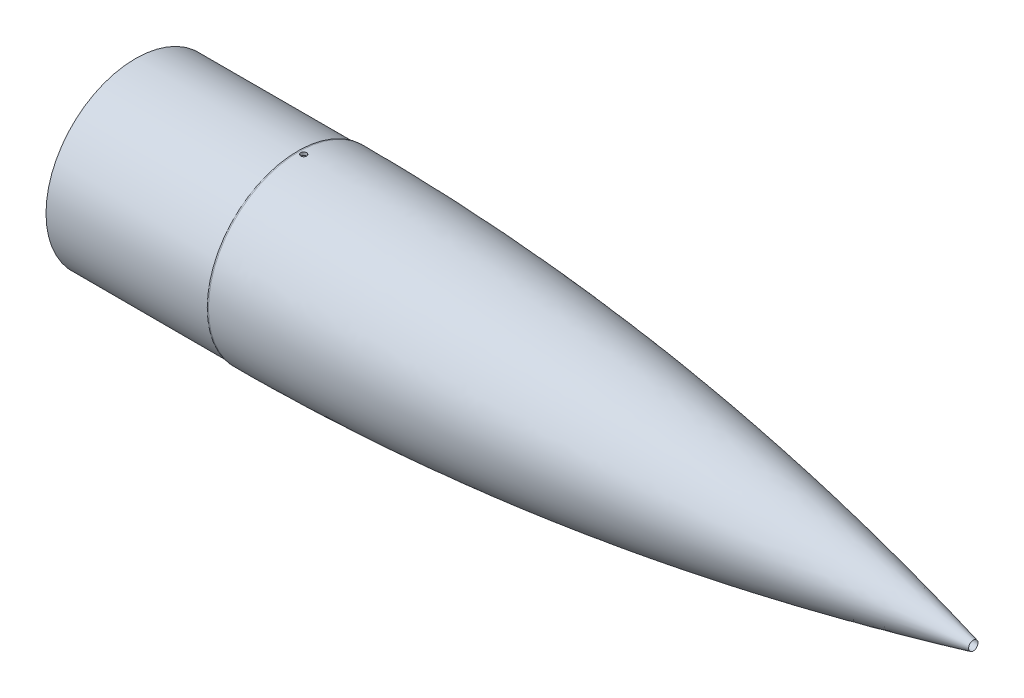
ISO-10303-21;
HEADER;
FILE_DESCRIPTION(('STEP AP214'),'2;1');
FILE_NAME('part.step','',(''),(''),'','','');
FILE_SCHEMA(('AUTOMOTIVE_DESIGN { 1 0 10303 214 1 1 1 1 }'));
ENDSEC;
DATA;
#1=APPLICATION_CONTEXT('core data for automotive mechanical design processes');
#2=APPLICATION_PROTOCOL_DEFINITION('international standard','automotive_design',2000,#1);
#3=PRODUCT_CONTEXT('',#1,'mechanical');
#4=PRODUCT('Part','Part','',(#3));
#5=PRODUCT_RELATED_PRODUCT_CATEGORY('part','',(#4));
#6=PRODUCT_DEFINITION_FORMATION('','',#4);
#7=PRODUCT_DEFINITION_CONTEXT('part definition',#1,'design');
#8=PRODUCT_DEFINITION('design','',#6,#7);
#9=PRODUCT_DEFINITION_SHAPE('','',#8);
#10=(LENGTH_UNIT() NAMED_UNIT(*) SI_UNIT(.MILLI.,.METRE.));
#11=(NAMED_UNIT(*) PLANE_ANGLE_UNIT() SI_UNIT($,.RADIAN.));
#12=(NAMED_UNIT(*) SI_UNIT($,.STERADIAN.) SOLID_ANGLE_UNIT());
#13=UNCERTAINTY_MEASURE_WITH_UNIT(LENGTH_MEASURE(1.E-05),#10,'distance_accuracy_value','');
#14=(GEOMETRIC_REPRESENTATION_CONTEXT(3) GLOBAL_UNCERTAINTY_ASSIGNED_CONTEXT((#13)) GLOBAL_UNIT_ASSIGNED_CONTEXT((#10,
#11,#12)) REPRESENTATION_CONTEXT('',''));
#15=CARTESIAN_POINT('',(0.,0.,0.));
#16=DIRECTION('',(0.,0.,1.));
#17=DIRECTION('',(1.,0.,0.));
#18=AXIS2_PLACEMENT_3D('',#15,#16,#17);
#19=CARTESIAN_POINT('',(88.7668195126856,2.42573931568999,0.));
#20=CARTESIAN_POINT('',(82.5476378756303,3.97635545257598,0.));
#21=CARTESIAN_POINT('',(70.0820617437255,7.03890394927207,0.));
#22=CARTESIAN_POINT('',(45.2414178831019,12.9595562465695,0.));
#23=CARTESIAN_POINT('',(14.2685183447714,19.9999188507769,0.));
#24=CARTESIAN_POINT('',(-22.745510554869,27.8644267328702,0.));
#25=CARTESIAN_POINT('',(-71.9031670770569,37.5743864435621,0.));
#26=CARTESIAN_POINT('',(-132.98103959557,48.2555079819381,0.));
#27=CARTESIAN_POINT('',(-205.685181970443,58.7429076068946,0.));
#28=CARTESIAN_POINT('',(-277.799454782986,66.9000725868815,0.));
#29=CARTESIAN_POINT('',(-337.403276199788,71.7557150649417,0.));
#30=CARTESIAN_POINT('',(-384.790988871913,74.4749392276872,0.));
#31=CARTESIAN_POINT('',(-420.185100497232,75.9316920010952,0.));
#32=CARTESIAN_POINT('',(-449.554479537446,76.6600810557362,0.));
#33=CARTESIAN_POINT('',(-472.982345416507,76.951439724511,0.));
#34=CARTESIAN_POINT('',(-484.660460903007,77.,0.));
#35=CARTESIAN_POINT('',(-490.504071490217,77.,0.));
#36=B_SPLINE_CURVE_WITH_KNOTS('',3,(#19,#20,#21,#22,#23,#24,#25,#26,#27,#28,#29,#30,#31,#32,#33,
#34,#35),.UNSPECIFIED.,.F.,.F.,(4,1,1,1,1,1,1,1,1,1,1,1,1,1,4),(0.,0.03125,0.0625,0.125,0.1875,
0.25,0.375,0.5,0.625,0.75,0.8125,0.875,0.9375,0.96875,1.),.UNSPECIFIED.);
#37=CARTESIAN_POINT('',(-218.288054543994,0.,0.));
#38=DIRECTION('',(-1.,0.,0.));
#39=AXIS1_PLACEMENT('',#37,#38);
#40=SURFACE_OF_REVOLUTION('',#36,#39);
#41=CARTESIAN_POINT('',(-490.504071490217,0.,0.));
#42=DIRECTION('',(-1.,0.,0.));
#43=DIRECTION('',(0.,0.,1.));
#44=AXIS2_PLACEMENT_3D('',#41,#42,#43);
#45=CIRCLE('',#44,77.);
#46=CARTESIAN_POINT('',(-490.504071490217,0.,77.));
#47=VERTEX_POINT('',#46);
#48=EDGE_CURVE('E48',#47,#47,#45,.T.);
#49=ORIENTED_EDGE('',*,*,#48,.F.);
#50=EDGE_LOOP('',(#49));
#51=FACE_BOUND('',#50,.T.);
#52=CARTESIAN_POINT('',(-486.504071490217,-76.955609676463,2.50000000000003));
#53=CARTESIAN_POINT('',(-486.363687300221,-76.9553437846844,2.4999937866829));
#54=CARTESIAN_POINT('',(-486.22320151556,-76.9554507303587,2.48813568024439));
#55=CARTESIAN_POINT('',(-485.9461000897,-76.9563791199443,2.44099661925044));
#56=CARTESIAN_POINT('',(-485.809489268186,-76.9572014165511,2.40568772333022));
#57=CARTESIAN_POINT('',(-485.54419225525,-76.959445602718,2.31265492008226));
#58=CARTESIAN_POINT('',(-485.415502228335,-76.9608671994187,2.25494196201291));
#59=CARTESIAN_POINT('',(-485.169672490435,-76.9641288109521,2.11875496421933));
#60=CARTESIAN_POINT('',(-485.052529974701,-76.9659687238202,2.04028598301796));
#61=CARTESIAN_POINT('',(-484.833030728989,-76.9698418527054,1.86477226585652));
#62=CARTESIAN_POINT('',(-484.730679760322,-76.9718751435347,1.76772032586514));
#63=CARTESIAN_POINT('',(-484.543717164875,-76.9758890073094,1.55780826295511));
#64=CARTESIAN_POINT('',(-484.459106246522,-76.9778695781468,1.44494750903188));
#65=CARTESIAN_POINT('',(-484.310013419422,-76.9815415869078,1.20659569068816));
#66=CARTESIAN_POINT('',(-484.245535688624,-76.9832329647866,1.08110201187555));
#67=CARTESIAN_POINT('',(-484.138565841944,-76.9861250726577,0.821065349301062));
#68=CARTESIAN_POINT('',(-484.096073641059,-76.9873258045469,0.686522400528623));
#69=CARTESIAN_POINT('',(-484.034292304283,-76.9890941792121,0.412245635707771));
#70=CARTESIAN_POINT('',(-484.014996759282,-76.9896619968556,0.272513264473196));
#71=CARTESIAN_POINT('',(-484.00013681605,-76.9900980380424,-0.00820836371522645));
#72=CARTESIAN_POINT('',(-484.004572324576,-76.9899662643346,-0.149197615728413));
#73=CARTESIAN_POINT('',(-484.037042770162,-76.989018847548,-0.42838420748387));
#74=CARTESIAN_POINT('',(-484.065070275034,-76.9882034198411,-0.566582412451434));
#75=CARTESIAN_POINT('',(-484.143917669907,-76.9859853219285,-0.836311363039803));
#76=CARTESIAN_POINT('',(-484.194737611025,-76.9845826504057,-0.967842093706342));
#77=CARTESIAN_POINT('',(-484.31773598396,-76.9813559038014,-1.2205264258201));
#78=CARTESIAN_POINT('',(-484.389917842244,-76.9795317611258,-1.34167835847759));
#79=CARTESIAN_POINT('',(-484.553588685017,-76.9756791972184,-1.57014761563982));
#80=CARTESIAN_POINT('',(-484.6450777122,-76.9736507755348,-1.67746490955073));
#81=CARTESIAN_POINT('',(-484.844807072065,-76.9696319963903,-1.87526070155881));
#82=CARTESIAN_POINT('',(-484.953053692334,-76.9676416535332,-1.96573285103578));
#83=CARTESIAN_POINT('',(-485.183203360847,-76.9639415587839,-2.12722099928412));
#84=CARTESIAN_POINT('',(-485.305106407594,-76.962231806861,-2.19823700018697));
#85=CARTESIAN_POINT('',(-485.5591071075,-76.9593053330567,-2.31879371120604));
#86=CARTESIAN_POINT('',(-485.691204481168,-76.9580885976643,-2.36833500983508));
#87=CARTESIAN_POINT('',(-485.961845980977,-76.9563065929209,-2.44453567894104));
#88=CARTESIAN_POINT('',(-486.100390088193,-76.9557413216577,-2.47119511658286));
#89=CARTESIAN_POINT('',(-486.379931059871,-76.9553483430697,-2.50086724390495));
#90=CARTESIAN_POINT('',(-486.520926892154,-76.9555203325024,-2.50388965427893));
#91=CARTESIAN_POINT('',(-486.801422816964,-76.9566043275174,-2.48622799279617));
#92=CARTESIAN_POINT('',(-486.940922910914,-76.9575163323956,-2.46554394348957));
#93=CARTESIAN_POINT('',(-487.214447418859,-76.959999574515,-2.40106364386671));
#94=CARTESIAN_POINT('',(-487.348472620817,-76.9615707165215,-2.35727073217279));
#95=CARTESIAN_POINT('',(-487.607268722266,-76.9652165029602,-2.24781999633696));
#96=CARTESIAN_POINT('',(-487.732039598584,-76.9672911486532,-2.18216211744838));
#97=CARTESIAN_POINT('',(-487.968837193324,-76.9717309808215,-2.03081600062915));
#98=CARTESIAN_POINT('',(-488.080859043594,-76.9740962775683,-1.94512014919633));
#99=CARTESIAN_POINT('',(-488.288929265988,-76.9788681664635,-1.75614188975986));
#100=CARTESIAN_POINT('',(-488.38497759422,-76.9812747587253,-1.65285943343342));
#101=CARTESIAN_POINT('',(-488.558406973471,-76.9858742639784,-1.4315973505268));
#102=CARTESIAN_POINT('',(-488.635781694954,-76.9880671043675,-1.31361276105622));
#103=CARTESIAN_POINT('',(-488.769623689054,-76.9920033483325,-1.06632071576965));
#104=CARTESIAN_POINT('',(-488.826091017306,-76.9937467531045,-0.937013290085652));
#105=CARTESIAN_POINT('',(-488.916501084992,-76.9965962355101,-0.670777589851211));
#106=CARTESIAN_POINT('',(-488.950449169353,-76.9977024643689,-0.5338511320418));
#107=CARTESIAN_POINT('',(-488.994875073282,-76.999158932395,-0.256238219976));
#108=CARTESIAN_POINT('',(-489.005352926624,-76.9995091726502,-0.115551771130303));
#109=CARTESIAN_POINT('',(-489.002540408434,-76.9994158681743,0.165515716477198));
#110=CARTESIAN_POINT('',(-488.989261363835,-76.9989727017275,0.305896868850779));
#111=CARTESIAN_POINT('',(-488.939335317021,-76.9973411339944,0.582436054100718));
#112=CARTESIAN_POINT('',(-488.90268826971,-76.99615273127,0.718594078826406));
#113=CARTESIAN_POINT('',(-488.807068292204,-76.9931586747981,0.982825837141073));
#114=CARTESIAN_POINT('',(-488.748095003117,-76.9913530111284,1.11089944073542));
#115=CARTESIAN_POINT('',(-488.609500130787,-76.9873184148982,1.35532560266974));
#116=CARTESIAN_POINT('',(-488.52987928297,-76.985089497414,1.47167857827068));
#117=CARTESIAN_POINT('',(-488.35221439401,-76.980445666407,1.68941395504578));
#118=CARTESIAN_POINT('',(-488.25416355192,-76.9780306844185,1.79079080506077));
#119=CARTESIAN_POINT('',(-488.04240622962,-76.9732712245026,1.97567294405395));
#120=CARTESIAN_POINT('',(-487.928695875134,-76.9709267641982,2.05917379728137));
#121=CARTESIAN_POINT('',(-487.688793816006,-76.9665535335403,2.20595337151964));
#122=CARTESIAN_POINT('',(-487.562593240307,-76.9645249902337,2.26921758272268));
#123=CARTESIAN_POINT('',(-487.301452602177,-76.9609967024213,2.37358595025316));
#124=CARTESIAN_POINT('',(-487.16652317029,-76.9594963285129,2.41471651366909));
#125=CARTESIAN_POINT('',(-486.942963851125,-76.9576015874746,2.46275712502178));
#126=CARTESIAN_POINT('',(-486.855785264353,-76.9570034140741,2.47670557047829));
#127=CARTESIAN_POINT('',(-486.680441650664,-76.9560909901666,2.49532895856865));
#128=CARTESIAN_POINT('',(-486.592276624035,-76.9557767395768,2.50000390390452));
#129=CARTESIAN_POINT('',(-486.504071490217,-76.955609676463,2.50000000000003));
#130=B_SPLINE_CURVE_WITH_KNOTS('',3,(#52,#53,#54,#55,#56,#57,#58,#59,#60,#61,#62,#63,#64,#65,
#66,#67,#68,#69,#70,#71,#72,#73,#74,#75,#76,#77,#78,#79,#80,#81,#82,#83,#84,#85,#86,#87,#88,#89,
#90,#91,#92,#93,#94,#95,#96,#97,#98,#99,#100,#101,#102,#103,#104,#105,#106,#107,#108,#109,#110,
#111,#112,#113,#114,#115,#116,#117,#118,#119,#120,#121,#122,#123,#124,#125,#126,#127,#128,#129),
.UNSPECIFIED.,.T.,.F.,(4,2,2,2,2,2,2,2,2,2,2,2,2,2,2,2,2,2,2,2,2,2,2,2,2,2,2,2,2,2,2,2,2,2,2,2,
2,2,4),(0.,0.420831382932315,0.842165083645621,1.26329312989162,1.68431863596458,
2.10550769212001,2.52671356471697,2.94800678605239,3.3692983785308,3.79047354366007,
4.21164705392506,4.63268793152611,5.05372975342456,5.47483914737209,5.89594947254257,
6.31721818648903,6.73848685428445,7.15974397650957,7.58099986221852,8.00208249793134,
8.42316473310091,8.84418614962052,9.265208620324,9.68639132076916,10.1075751785189,
10.5289015993051,10.9502268989042,11.3714521614036,11.7926768177851,12.2137006941156,
12.6347253829751,13.055756840039,13.476773302844,13.8979454331881,14.3192219523797,
14.7407998560845,15.1618736645394,15.4262873372119,15.6907009328422),.UNSPECIFIED.);
#131=CARTESIAN_POINT('',(-486.504071490217,-76.955609676463,2.50000000000003));
#132=VERTEX_POINT('',#131);
#133=EDGE_CURVE('E81',#132,#132,#130,.T.);
#134=ORIENTED_EDGE('',*,*,#133,.T.);
#135=EDGE_LOOP('',(#134));
#136=FACE_BOUND('',#135,.T.);
#137=CARTESIAN_POINT('',(-484.004071490217,76.9899826652943,0.));
#138=CARTESIAN_POINT('',(-484.004077703659,76.9899821503234,0.140394389242586));
#139=CARTESIAN_POINT('',(-484.015937526241,76.9896312038333,0.280889698748085));
#140=CARTESIAN_POINT('',(-484.063082844252,76.9882667957249,0.558008611478985));
#141=CARTESIAN_POINT('',(-484.098396300097,76.9872525433639,0.694627390320553));
#142=CARTESIAN_POINT('',(-484.191440732664,76.9846820593271,0.959938715189415));
#143=CARTESIAN_POINT('',(-484.249160759101,76.9831260924301,1.08863509742098));
#144=CARTESIAN_POINT('',(-484.385364326309,76.9796569072274,1.33447581788796));
#145=CARTESIAN_POINT('',(-484.463842802309,76.9777437760983,1.45162296441786));
#146=CARTESIAN_POINT('',(-484.6393768674,76.9737872751989,1.67112805661043));
#147=CARTESIAN_POINT('',(-484.736439441922,76.9717438566491,1.77348041570776));
#148=CARTESIAN_POINT('',(-484.946374470948,76.9677731537599,1.96044333719226));
#149=CARTESIAN_POINT('',(-485.059247550909,76.9658458740191,2.04505319736293));
#150=CARTESIAN_POINT('',(-485.297616617728,76.9623426588729,2.19413548237792));
#151=CARTESIAN_POINT('',(-485.423114338489,76.9607667718245,2.25860513610302));
#152=CARTESIAN_POINT('',(-485.683157700392,76.9581646178995,2.36555823922017));
#153=CARTESIAN_POINT('',(-485.817703302728,76.9571383486658,2.40804178290403));
#154=CARTESIAN_POINT('',(-486.091975004141,76.9557730803097,2.4698035778229));
#155=CARTESIAN_POINT('',(-486.231699346839,76.9554338503097,2.48908962362831));
#156=CARTESIAN_POINT('',(-486.512402197027,76.9555026249686,2.50393372097728));
#157=CARTESIAN_POINT('',(-486.653380699568,76.9559106266808,2.49949186609126));
#158=CARTESIAN_POINT('',(-486.932544703465,76.9574501156315,2.467012686805));
#159=CARTESIAN_POINT('',(-487.070731048874,76.9585813807513,2.43898260565411));
#160=CARTESIAN_POINT('',(-487.340435157611,76.9614616836355,2.36013458682655));
#161=CARTESIAN_POINT('',(-487.471952903273,76.9632107230364,2.30931658878355));
#162=CARTESIAN_POINT('',(-487.724620570756,76.9671508986712,2.18632262892116));
#163=CARTESIAN_POINT('',(-487.84576809993,76.969342136541,2.11414175523071));
#164=CARTESIAN_POINT('',(-488.074228794201,76.9739388918785,1.95047468242791));
#165=CARTESIAN_POINT('',(-488.181541922659,76.9763444099136,1.8589884321899));
#166=CARTESIAN_POINT('',(-488.379337094814,76.9811169867884,1.65925923602315));
#167=CARTESIAN_POINT('',(-488.469811694016,76.983484028197,1.55100891708365));
#168=CARTESIAN_POINT('',(-488.631303889499,76.9879262429006,1.32085028392671));
#169=CARTESIAN_POINT('',(-488.702321486815,76.9900014162112,1.19894197043621));
#170=CARTESIAN_POINT('',(-488.82287996293,76.9936372776188,0.944929010952758));
#171=CARTESIAN_POINT('',(-488.872421478249,76.9951979809637,0.812824667292453));
#172=CARTESIAN_POINT('',(-488.948620505208,76.9976369233208,0.542167283492297));
#173=CARTESIAN_POINT('',(-488.975278092782,76.9985151645977,0.403614264752151));
#174=CARTESIAN_POINT('',(-489.004942516642,76.9994941612415,0.12406372018649));
#175=CARTESIAN_POINT('',(-489.007960684461,76.9995952891166,-0.0169326019551275));
#176=CARTESIAN_POINT('',(-488.990290129693,76.9990101289092,-0.297429940091316));
#177=CARTESIAN_POINT('',(-488.969601440974,76.9983238419516,-0.436930958221743));
#178=CARTESIAN_POINT('',(-488.905113607573,76.9962381176479,-0.710447055661188));
#179=CARTESIAN_POINT('',(-488.861319462012,76.9948388345686,-0.844463314901972));
#180=CARTESIAN_POINT('',(-488.75186906614,76.9914777821513,-1.10324187414485));
#181=CARTESIAN_POINT('',(-488.686212763911,76.9895160114773,-1.2280041521697));
#182=CARTESIAN_POINT('',(-488.53487355573,76.9852395369677,-1.46478407258116));
#183=CARTESIAN_POINT('',(-488.449183218729,76.982924702284,-1.57679696297064));
#184=CARTESIAN_POINT('',(-488.260219471325,76.978189652007,-1.78485093083714));
#185=CARTESIAN_POINT('',(-488.156946006423,76.9757694360869,-1.88089195880598));
#186=CARTESIAN_POINT('',(-487.935697886898,76.9710787962703,-2.05431503975436));
#187=CARTESIAN_POINT('',(-487.817717332277,76.9688084330519,-2.13168956757878));
#188=CARTESIAN_POINT('',(-487.57043410464,76.964655759959,-2.26553225387501));
#189=CARTESIAN_POINT('',(-487.441131456044,76.9627734492474,-2.3220004574395));
#190=CARTESIAN_POINT('',(-487.174894705662,76.9595888734068,-2.41241731837008));
#191=CARTESIAN_POINT('',(-487.037961822101,76.9582865159805,-2.44636955947829));
#192=CARTESIAN_POINT('',(-486.760334490177,76.9563865330559,-2.49080146370667));
#193=CARTESIAN_POINT('',(-486.619640046534,76.9557889066731,-2.50128115628133));
#194=CARTESIAN_POINT('',(-486.338552252986,76.955343460011,-2.49846933084608));
#195=CARTESIAN_POINT('',(-486.19815879487,76.9554952972189,-2.4851886733391));
#196=CARTESIAN_POINT('',(-485.92159429877,76.9565083906923,-2.43525474255776));
#197=CARTESIAN_POINT('',(-485.78542326773,76.9573696481246,-2.39860143084342));
#198=CARTESIAN_POINT('',(-485.521173526692,76.9596825925446,-2.30296645411634));
#199=CARTESIAN_POINT('',(-485.393094499199,76.9611342563507,-2.24398566577124));
#200=CARTESIAN_POINT('',(-485.148658615802,76.9644438081828,-2.10537302623537));
#201=CARTESIAN_POINT('',(-485.032301336745,76.966301681537,-2.02574192088925));
#202=CARTESIAN_POINT('',(-484.814568398215,76.9701963507563,-1.84806130975349));
#203=CARTESIAN_POINT('',(-484.713197115894,76.9722331986209,-1.75000644161765));
#204=CARTESIAN_POINT('',(-484.528326731321,76.9762401320159,-1.53824237878785));
#205=CARTESIAN_POINT('',(-484.444832060675,76.9782102008901,-1.42452931388454));
#206=CARTESIAN_POINT('',(-484.29806762394,76.9818489358326,-1.18462757079181));
#207=CARTESIAN_POINT('',(-484.23481176311,76.9835173943359,-1.05843039288189));
#208=CARTESIAN_POINT('',(-484.130458651674,76.9863509199782,-0.797299764832831));
#209=CARTESIAN_POINT('',(-484.089335002287,76.9875165865045,-0.662376938682988));
#210=CARTESIAN_POINT('',(-484.041304648752,76.9888950911007,-0.438835680175407));
#211=CARTESIAN_POINT('',(-484.027359789812,76.9893010789961,-0.351667752988811));
#212=CARTESIAN_POINT('',(-484.008741260257,76.989845027803,-0.176346491799912));
#213=CARTESIAN_POINT('',(-484.004067587048,76.9899829887895,-0.0881931580732174));
#214=CARTESIAN_POINT('',(-484.004071490217,76.9899826652943,0.));
#215=B_SPLINE_CURVE_WITH_KNOTS('',3,(#137,#138,#139,#140,#141,#142,#143,#144,#145,#146,#147,
#148,#149,#150,#151,#152,#153,#154,#155,#156,#157,#158,#159,#160,#161,#162,#163,#164,#165,#166,
#167,#168,#169,#170,#171,#172,#173,#174,#175,#176,#177,#178,#179,#180,#181,#182,#183,#184,#185,
#186,#187,#188,#189,#190,#191,#192,#193,#194,#195,#196,#197,#198,#199,#200,#201,#202,#203,#204,
#205,#206,#207,#208,#209,#210,#211,#212,#213,#214),.UNSPECIFIED.,.T.,.F.,(4,2,2,2,2,2,2,2,2,2,2,
2,2,2,2,2,2,2,2,2,2,2,2,2,2,2,2,2,2,2,2,2,2,2,2,2,2,2,4),(0.,0.420861262865868,0.84222516125708,
1.26338339418358,1.68443896502072,2.10565311494067,2.52688393262152,2.94817268254037,
3.36945962566352,3.79060497296025,4.21174865948132,4.63276307235223,5.05377860051817,
5.47489100621618,5.89600452714338,6.31730378691887,6.73860302427146,7.15988977405689,
7.58117512591658,8.00225852267644,8.423341317891,8.84433304455017,9.26532577098904,
9.68647490102253,10.1076253364731,10.5289452705533,10.9502642958865,11.3715162460788,
11.7927676676634,12.2138265906738,12.6348862061832,13.0559292908923,13.4769571705561,
13.8981077832594,14.3193626785064,14.7409063823679,15.1619461581439,15.4263234916262,
15.6907007511667),.UNSPECIFIED.);
#216=CARTESIAN_POINT('',(-484.004071490217,76.9899826652943,0.));
#217=VERTEX_POINT('',#216);
#218=EDGE_CURVE('E86',#217,#217,#215,.T.);
#219=ORIENTED_EDGE('',*,*,#218,.T.);
#220=EDGE_LOOP('',(#219));
#221=FACE_BOUND('',#220,.T.);
#222=CARTESIAN_POINT('',(82.4211993851975,0.,0.));
#223=DIRECTION('',(-1.,0.,0.));
#224=DIRECTION('',(0.,0.,1.));
#225=AXIS2_PLACEMENT_3D('',#222,#223,#224);
#226=CIRCLE('',#225,4.);
#227=CARTESIAN_POINT('',(82.4211993851975,0.,4.));
#228=VERTEX_POINT('',#227);
#229=EDGE_CURVE('E59',#228,#228,#226,.F.);
#230=ORIENTED_EDGE('',*,*,#229,.F.);
#231=EDGE_LOOP('',(#230));
#232=FACE_BOUND('',#231,.T.);
#233=ADVANCED_FACE('F35',(#51,#136,#221,#232),#40,.T.);
#234=CARTESIAN_POINT('',(-490.504071490217,74.5,0.));
#235=CARTESIAN_POINT('',(-210.641164774734,74.5,0.));
#236=CARTESIAN_POINT('',(88.1620147736865,0.,0.));
#237=B_SPLINE_CURVE_WITH_KNOTS('',2,(#234,#235,#236),.UNSPECIFIED.,.F.,.F.,(3,3),(0.,1.),.UNSPECIFIED.);
#238=CARTESIAN_POINT('',(-218.288054543994,0.,0.));
#239=DIRECTION('',(-1.,0.,0.));
#240=AXIS1_PLACEMENT('',#238,#239);
#241=SURFACE_OF_REVOLUTION('',#237,#240);
#242=CARTESIAN_POINT('',(-490.504071490217,0.,0.));
#243=DIRECTION('',(-1.,0.,0.));
#244=DIRECTION('',(0.,0.,1.));
#245=AXIS2_PLACEMENT_3D('',#242,#243,#244);
#246=CIRCLE('',#245,74.5);
#247=CARTESIAN_POINT('',(-490.504071490217,0.,74.5));
#248=VERTEX_POINT('',#247);
#249=EDGE_CURVE('E43',#248,#248,#246,.T.);
#250=ORIENTED_EDGE('',*,*,#249,.T.);
#251=EDGE_LOOP('',(#250));
#252=FACE_BOUND('',#251,.T.);
#253=CARTESIAN_POINT('',(-486.504071490217,-74.4542368266292,2.50000000000002));
#254=CARTESIAN_POINT('',(-486.644463728941,-74.4545044078244,2.4999937854301));
#255=CARTESIAN_POINT('',(-486.784956126103,-74.4551582433375,2.48813430989882));
#256=CARTESIAN_POINT('',(-487.062067466266,-74.4571903018333,2.44099131212503));
#257=CARTESIAN_POINT('',(-487.198681582556,-74.4585693890628,2.40567983005134));
#258=CARTESIAN_POINT('',(-487.463981880998,-74.4619172709366,2.31264211577024));
#259=CARTESIAN_POINT('',(-487.592671933481,-74.4638857748944,2.25492692839635));
#260=CARTESIAN_POINT('',(-487.838500426763,-74.4682109629232,2.11873613865985));
#261=CARTESIAN_POINT('',(-487.955641669936,-74.470567552451,2.04026558978918));
#262=CARTESIAN_POINT('',(-488.175145474543,-74.4754236412933,1.86474317176444));
#263=CARTESIAN_POINT('',(-488.277501314691,-74.4779232048861,1.7676828982606));
#264=CARTESIAN_POINT('',(-488.464471747665,-74.4827991147714,1.55775134697652));
#265=CARTESIAN_POINT('',(-488.549085633945,-74.4851754561541,1.44487943982123));
#266=CARTESIAN_POINT('',(-488.698179387077,-74.4895509889335,1.2065059198627));
#267=CARTESIAN_POINT('',(-488.76265571212,-74.4915501139608,1.08100209047498));
#268=CARTESIAN_POINT('',(-488.869620153436,-74.4949556262059,0.820942982532191));
#269=CARTESIAN_POINT('',(-488.912108373095,-74.4963620162107,0.686387746539526));
#270=CARTESIAN_POINT('',(-488.973873846024,-74.4984298324484,0.412104112739233));
#271=CARTESIAN_POINT('',(-488.993160651756,-74.4990915652636,0.272377868374531));
#272=CARTESIAN_POINT('',(-489.008005359737,-74.4995995974477,-0.0083305027207477));
#273=CARTESIAN_POINT('',(-489.003563371693,-74.4994459005867,-0.149312623641916));
#274=CARTESIAN_POINT('',(-488.971084175179,-74.4983399313464,-0.42846968382387));
#275=CARTESIAN_POINT('',(-488.943056697051,-74.4973879882893,-0.5666457566655));
#276=CARTESIAN_POINT('',(-488.864217236505,-74.4947886923056,-0.836330399503575));
#277=CARTESIAN_POINT('',(-488.813405198193,-74.4931413376731,-0.967838953142592));
#278=CARTESIAN_POINT('',(-488.690428037593,-74.4893281592209,-1.22048669191173));
#279=CARTESIAN_POINT('',(-488.618258482963,-74.4871622277984,-1.3416237178959));
#280=CARTESIAN_POINT('',(-488.454618405035,-74.4825443879378,-1.57006621420603));
#281=CARTESIAN_POINT('',(-488.363147822488,-74.4800924786218,-1.67737164207153));
#282=CARTESIAN_POINT('',(-488.163446204433,-74.4751628036371,-1.87516297966553));
#283=CARTESIAN_POINT('',(-488.055206545229,-74.4726850252799,-1.96564018230131));
#284=CARTESIAN_POINT('',(-487.825069773142,-74.4679668181259,-2.12714005723163));
#285=CARTESIAN_POINT('',(-487.703172653845,-74.4657263894406,-2.19816272038833));
#286=CARTESIAN_POINT('',(-487.449170617167,-74.4617159270933,-2.31873943860691));
#287=CARTESIAN_POINT('',(-487.317065135555,-74.4599459194561,-2.36829230600279));
#288=CARTESIAN_POINT('',(-487.046402660187,-74.4570550957919,-2.44451297210784));
#289=CARTESIAN_POINT('',(-486.907845687027,-74.4559342776926,-2.47118084387134));
#290=CARTESIAN_POINT('',(-486.62828210579,-74.4544465491374,-2.50086421245307));
#291=CARTESIAN_POINT('',(-486.48727666486,-74.4540792889097,-2.50389068450896));
#292=CARTESIAN_POINT('',(-486.20675854272,-74.4541164814406,-2.48623319241368));
#293=CARTESIAN_POINT('',(-486.067245859017,-74.4545209329106,-2.46554926785344));
#294=CARTESIAN_POINT('',(-485.79371161331,-74.4560333159458,-2.40106818283245));
#295=CARTESIAN_POINT('',(-485.659688606643,-74.45714106115,-2.35727714589081));
#296=CARTESIAN_POINT('',(-485.400895523684,-74.4599134551598,-2.24783029317869));
#297=CARTESIAN_POINT('',(-485.276125466428,-74.4615781051111,-2.18217443242444));
#298=CARTESIAN_POINT('',(-485.039336857031,-74.4652573006243,-2.0308376588853));
#299=CARTESIAN_POINT('',(-484.927322331756,-74.4672719561773,-1.94515044820936));
#300=CARTESIAN_POINT('',(-484.71926440583,-74.4714058147481,-1.75619250079933));
#301=CARTESIAN_POINT('',(-484.623221051279,-74.4735250180677,-1.65292171331385));
#302=CARTESIAN_POINT('',(-484.449795483456,-74.4776146165129,-1.43168196610082));
#303=CARTESIAN_POINT('',(-484.372420269891,-74.4795849556316,-1.31370751823489));
#304=CARTESIAN_POINT('',(-484.238574780938,-74.4831414222725,-1.06643745322612));
#305=CARTESIAN_POINT('',(-484.182104460248,-74.4847275506273,-0.937141860616894));
#306=CARTESIAN_POINT('',(-484.091681063459,-74.4873275176345,-0.670918919449779));
#307=CARTESIAN_POINT('',(-484.057724632967,-74.4883414415374,-0.533992711090616));
#308=CARTESIAN_POINT('',(-484.013282357278,-74.4896775980079,-0.256379488814898));
#309=CARTESIAN_POINT('',(-484.002796488627,-74.4899998312667,-0.115692478656614));
#310=CARTESIAN_POINT('',(-484.005593450161,-74.489914608976,0.165386802510706));
#311=CARTESIAN_POINT('',(-484.018866519102,-74.4895074530925,0.305779170847911));
#312=CARTESIAN_POINT('',(-484.06878451243,-74.4880120430529,0.582341868644443));
#313=CARTESIAN_POINT('',(-484.105429484194,-74.4869237875162,0.718512189544795));
#314=CARTESIAN_POINT('',(-484.201049744013,-74.4841946212149,0.982769080852701));
#315=CARTESIAN_POINT('',(-484.260025400286,-74.4825537013373,1.11085551792157));
#316=CARTESIAN_POINT('',(-484.398629805826,-74.4789135348015,1.35530670323674));
#317=CARTESIAN_POINT('',(-484.478257813244,-74.476914301015,1.47167187231108));
#318=CARTESIAN_POINT('',(-484.655935874806,-74.4727946908555,1.68942238166123));
#319=CARTESIAN_POINT('',(-484.753991531484,-74.4706742777775,1.7908031494592));
#320=CARTESIAN_POINT('',(-484.965760342821,-74.4665670103874,1.97569176395234));
#321=CARTESIAN_POINT('',(-485.079477361259,-74.4645801892141,2.05919518714065));
#322=CARTESIAN_POINT('',(-485.319382839004,-74.4609817900343,2.20597109237405));
#323=CARTESIAN_POINT('',(-485.445579067199,-74.4593704479025,2.26923086668858));
#324=CARTESIAN_POINT('',(-485.70670893332,-74.4567288194691,2.37359180628648));
#325=CARTESIAN_POINT('',(-485.841631944572,-74.455697840771,2.41471937357467));
#326=CARTESIAN_POINT('',(-486.065183741084,-74.4546013752057,2.46275795724256));
#327=CARTESIAN_POINT('',(-486.152362157122,-74.454319394003,2.47670617577304));
#328=CARTESIAN_POINT('',(-486.32770436774,-74.4540530640124,2.4953291476203));
#329=CARTESIAN_POINT('',(-486.415868161954,-74.4540687151138,2.50000390438787));
#330=CARTESIAN_POINT('',(-486.504071490217,-74.4542368266292,2.50000000000002));
#331=B_SPLINE_CURVE_WITH_KNOTS('',3,(#253,#254,#255,#256,#257,#258,#259,#260,#261,#262,#263,
#264,#265,#266,#267,#268,#269,#270,#271,#272,#273,#274,#275,#276,#277,#278,#279,#280,#281,#282,
#283,#284,#285,#286,#287,#288,#289,#290,#291,#292,#293,#294,#295,#296,#297,#298,#299,#300,#301,
#302,#303,#304,#305,#306,#307,#308,#309,#310,#311,#312,#313,#314,#315,#316,#317,#318,#319,#320,
#321,#322,#323,#324,#325,#326,#327,#328,#329,#330),.UNSPECIFIED.,.T.,.F.,(4,2,2,2,2,2,2,2,2,2,2,
2,2,2,2,2,2,2,2,2,2,2,2,2,2,2,2,2,2,2,2,2,2,2,2,2,2,2,4),(0.,0.420855505066224,
0.842213663189566,1.26336435865132,1.68441260706015,2.10565166117162,2.52690748728338,
2.9482373624935,3.36956525662336,3.79071962264072,4.21187204150172,4.63285079643599,
5.05383058410756,5.47489779938394,5.89596630722854,6.31725207773442,6.73853804611861,
7.15984731622242,7.58115524140222,8.00226756777532,8.42337919098843,8.84437927317862,
9.26538022152179,9.68651371173067,10.1076484174756,10.5289407850725,10.9502322397258,
11.3714609111542,11.7926891616533,12.213744392292,12.6348004764421,13.055863503839,
13.476911408441,13.8980875313776,14.3193677485042,14.7409119032936,15.16195206757,
15.4263603455131,15.6907685250662),.UNSPECIFIED.);
#332=CARTESIAN_POINT('',(-486.504071490217,-74.4542368266292,2.50000000000002));
#333=VERTEX_POINT('',#332);
#334=EDGE_CURVE('E52',#333,#333,#331,.T.);
#335=ORIENTED_EDGE('',*,*,#334,.T.);
#336=EDGE_LOOP('',(#335));
#337=FACE_BOUND('',#336,.T.);
#338=CARTESIAN_POINT('',(-489.004071490217,74.4994650547164,0.));
#339=CARTESIAN_POINT('',(-489.004065275726,74.4994644982127,0.140380940897853));
#340=CARTESIAN_POINT('',(-488.992207700577,74.4990556571774,0.280862739450675));
#341=CARTESIAN_POINT('',(-488.945071684368,74.4974621578085,0.557954513824571));
#342=CARTESIAN_POINT('',(-488.909765303682,74.4962765739966,0.694559667849534));
#343=CARTESIAN_POINT('',(-488.816740679959,74.4932581519682,0.959843724144506));
#344=CARTESIAN_POINT('',(-488.759033482869,74.491425632799,1.08852649679991));
#345=CARTESIAN_POINT('',(-488.622861521136,74.4873107564016,1.3343423060559));
#346=CARTESIAN_POINT('',(-488.544401803251,74.4850285085763,1.45147814123588));
#347=CARTESIAN_POINT('',(-488.368902591351,74.480257140912,1.67097511423343));
#348=CARTESIAN_POINT('',(-488.27185442046,74.4777679247707,1.7733293128628));
#349=CARTESIAN_POINT('',(-488.061949102018,74.4728483229873,1.96029921166308));
#350=CARTESIAN_POINT('',(-487.949091318653,74.4704179397159,2.04491419807552));
#351=CARTESIAN_POINT('',(-487.71073768848,74.4658713704333,2.19401977369093));
#352=CARTESIAN_POINT('',(-487.585238617156,74.46375526493,2.25850521100401));
#353=CARTESIAN_POINT('',(-487.325187583283,74.460056665939,2.3654885769337));
#354=CARTESIAN_POINT('',(-487.190635659043,74.4584741701937,2.4079865985853));
#355=CARTESIAN_POINT('',(-486.916346913276,74.4560003242027,2.46977431741397));
#356=CARTESIAN_POINT('',(-486.776611887661,74.455108736863,2.48907197734895));
#357=CARTESIAN_POINT('',(-486.49588298741,74.4540940756463,2.50393493991073));
#358=CARTESIAN_POINT('',(-486.354889118559,74.4539709982398,2.49950035153312));
#359=CARTESIAN_POINT('',(-486.075707001861,74.4544845226066,2.46703160022829));
#360=CARTESIAN_POINT('',(-485.937517604432,74.4551208064405,2.43900731559411));
#361=CARTESIAN_POINT('',(-485.667805048508,74.457058586905,2.36016918967949));
#362=CARTESIAN_POINT('',(-485.536281903629,74.4583600848941,2.30935530185161));
#363=CARTESIAN_POINT('',(-485.283614695294,74.4614606763681,2.18637353496436));
#364=CARTESIAN_POINT('',(-485.162472031825,74.4632598368333,2.11420278139284));
#365=CARTESIAN_POINT('',(-484.93401854405,74.4671334888687,1.95055800800509));
#366=CARTESIAN_POINT('',(-484.826707755574,74.4692079811519,1.85908393818988));
#367=CARTESIAN_POINT('',(-484.628914328223,74.473382355977,1.65938096610905));
#368=CARTESIAN_POINT('',(-484.538439178912,74.4754822493785,1.55114464597248));
#369=CARTESIAN_POINT('',(-484.376942645524,74.4794553376899,1.3210158857463));
#370=CARTESIAN_POINT('',(-484.305921268554,74.481328532517,1.19912344066848));
#371=CARTESIAN_POINT('',(-484.185346361045,74.4846257871103,0.945133322189576));
#372=CARTESIAN_POINT('',(-484.135793897178,74.4860498245595,0.813035142106791));
#373=CARTESIAN_POINT('',(-484.059571843789,74.4882801217686,0.54238923544801));
#374=CARTESIAN_POINT('',(-484.032902189766,74.48908638327,0.403841527053007));
#375=CARTESIAN_POINT('',(-484.003211169963,74.4899857477842,0.124288621632354));
#376=CARTESIAN_POINT('',(-484.000180379936,74.4900791350026,-0.0167155735779911));
#377=CARTESIAN_POINT('',(-484.017828563549,74.4895424917415,-0.297230748723924));
#378=CARTESIAN_POINT('',(-484.038507508955,74.4889124621235,-0.436741730437478));
#379=CARTESIAN_POINT('',(-484.102980146395,74.4870034903078,-0.710283093842946));
#380=CARTESIAN_POINT('',(-484.14676941541,74.4857246722816,-0.844314518964649));
#381=CARTESIAN_POINT('',(-484.256215300134,74.4826692349608,-1.103124146389));
#382=CARTESIAN_POINT('',(-484.321871963744,74.4808926145757,-1.2279023284216));
#383=CARTESIAN_POINT('',(-484.473214009074,74.4770515002918,-1.46470805049991));
#384=CARTESIAN_POINT('',(-484.558905916819,74.4749869126828,-1.57673141823845));
#385=CARTESIAN_POINT('',(-484.747876549935,74.4708166236298,-1.78480548439609));
#386=CARTESIAN_POINT('',(-484.85115532034,74.4687109220805,-1.88085614191424));
#387=CARTESIAN_POINT('',(-485.072407281318,74.4647116062455,-2.05428856810111));
#388=CARTESIAN_POINT('',(-485.190385082148,74.4628180588561,-2.13166445708554));
#389=CARTESIAN_POINT('',(-485.43766254952,74.4594763610704,-2.26551033257046));
#390=CARTESIAN_POINT('',(-485.566962186058,74.4580282094939,-2.32198037447223));
#391=CARTESIAN_POINT('',(-485.83318322232,74.4557617749627,-2.41239855092666));
#392=CARTESIAN_POINT('',(-485.97010291897,74.4549433518659,-2.44635169624111));
#393=CARTESIAN_POINT('',(-486.247701618942,74.4540502136968,-2.49078969795387));
#394=CARTESIAN_POINT('',(-486.388380617858,74.453975497753,-2.50127458185117));
#395=CARTESIAN_POINT('',(-486.669440031349,74.4546006390132,-2.49847862533439));
#396=CARTESIAN_POINT('',(-486.809820547903,74.4553001649043,-2.48520794887981));
#397=CARTESIAN_POINT('',(-487.086358941986,74.4574168184714,-2.43529925646744));
#398=CARTESIAN_POINT('',(-487.222516809643,74.4588339478248,-2.39866118588562));
#399=CARTESIAN_POINT('',(-487.486757211647,74.4622479218535,-2.30305692369611));
#400=CARTESIAN_POINT('',(-487.614839148376,74.4642448093698,-2.24408908194324));
#401=CARTESIAN_POINT('',(-487.859282517295,74.4686136123036,-2.10550275224038));
#402=CARTESIAN_POINT('',(-487.975644364355,74.4709855144386,-2.02588499561888));
#403=CARTESIAN_POINT('',(-488.193399224473,74.4758568263299,-1.8482223012321));
#404=CARTESIAN_POINT('',(-488.294786498258,74.478356284483,-1.75017033078097));
#405=CARTESIAN_POINT('',(-488.479688653392,74.4832171143078,-1.53840716955047));
#406=CARTESIAN_POINT('',(-488.563199107687,74.48557845167,-1.4246921113621));
#407=CARTESIAN_POINT('',(-488.709991146058,74.4899110592042,-1.18478518806402));
#408=CARTESIAN_POINT('',(-488.773259548197,74.4918820748759,-1.05858526235441));
#409=CARTESIAN_POINT('',(-488.877636214218,74.4952176414537,-0.797444555470739));
#410=CARTESIAN_POINT('',(-488.918770889732,74.4965829148344,-0.66251440830569));
#411=CARTESIAN_POINT('',(-488.966819791768,74.4981953377144,-0.438944058744785));
#412=CARTESIAN_POINT('',(-488.98077157147,74.4986694952422,-0.351755079983048));
#413=CARTESIAN_POINT('',(-488.999399371488,74.4993045285358,-0.176390676297487));
#414=CARTESIAN_POINT('',(-489.004075395397,74.4994654044229,-0.0882152517555826));
#415=CARTESIAN_POINT('',(-489.004071490217,74.4994650547164,0.));
#416=B_SPLINE_CURVE_WITH_KNOTS('',3,(#338,#339,#340,#341,#342,#343,#344,#345,#346,#347,#348,
#349,#350,#351,#352,#353,#354,#355,#356,#357,#358,#359,#360,#361,#362,#363,#364,#365,#366,#367,
#368,#369,#370,#371,#372,#373,#374,#375,#376,#377,#378,#379,#380,#381,#382,#383,#384,#385,#386,
#387,#388,#389,#390,#391,#392,#393,#394,#395,#396,#397,#398,#399,#400,#401,#402,#403,#404,#405,
#406,#407,#408,#409,#410,#411,#412,#413,#414,#415),.UNSPECIFIED.,.T.,.F.,(4,2,2,2,2,2,2,2,2,2,2,
2,2,2,2,2,2,2,2,2,2,2,2,2,2,2,2,2,2,2,2,2,2,2,2,2,2,2,4),(0.,0.420820809757613,
0.842143935915225,1.26325956903948,1.68427288601694,2.10548320821295,2.52671047505994,
2.94804546118964,3.36937866451725,3.79056721781779,4.21175383671897,4.63276416949132,
5.05377536217522,5.4748432463543,5.89591222118662,6.31716806877632,6.73842407023932,
7.15970099915446,7.58097674057679,8.00208452086873,8.42319179969292,8.84421851320666,
9.26524614898922,9.68641111645826,10.1075771623784,10.5288756384482,10.9501729980531,
11.371376573432,11.7925796552646,12.2136025658947,12.6346264607186,13.0556814748123,
13.4767215790386,13.8979226379765,14.3192278836913,14.7408069340769,15.16188180261,
15.4263253076296,15.6907687102691),.UNSPECIFIED.);
#417=CARTESIAN_POINT('',(-489.004071490217,74.4994650547164,0.));
#418=VERTEX_POINT('',#417);
#419=EDGE_CURVE('E58',#418,#418,#416,.T.);
#420=ORIENTED_EDGE('',*,*,#419,.T.);
#421=EDGE_LOOP('',(#420));
#422=FACE_BOUND('',#421,.T.);
#423=CARTESIAN_POINT('',(71.9115937133173,0.,0.));
#424=DIRECTION('',(-1.,0.,0.));
#425=DIRECTION('',(0.,0.,1.));
#426=AXIS2_PLACEMENT_3D('',#423,#424,#425);
#427=CIRCLE('',#426,3.99999999999999);
#428=CARTESIAN_POINT('',(71.9115937133173,0.,3.99999999999999));
#429=VERTEX_POINT('',#428);
#430=EDGE_CURVE('E39',#429,#429,#427,.T.);
#431=ORIENTED_EDGE('',*,*,#430,.F.);
#432=EDGE_LOOP('',(#431));
#433=FACE_BOUND('',#432,.T.);
#434=ADVANCED_FACE('F62',(#252,#337,#422,#433),#241,.T.);
#435=CARTESIAN_POINT('',(-491.504071490217,74.5,0.));
#436=DIRECTION('',(1.,0.,0.));
#437=DIRECTION('',(0.,0.,-1.));
#438=AXIS2_PLACEMENT_3D('',#435,#436,#437);
#439=PLANE('',#438);
#440=CARTESIAN_POINT('',(-491.504071490217,0.,0.));
#441=DIRECTION('',(-1.,0.,0.));
#442=DIRECTION('',(0.,0.,1.));
#443=AXIS2_PLACEMENT_3D('',#440,#441,#442);
#444=CIRCLE('',#443,77.);
#445=CARTESIAN_POINT('',(-491.504071490217,0.,77.));
#446=VERTEX_POINT('',#445);
#447=EDGE_CURVE('E105',#446,#446,#444,.T.);
#448=ORIENTED_EDGE('',*,*,#447,.T.);
#449=EDGE_LOOP('',(#448));
#450=FACE_BOUND('',#449,.T.);
#451=CARTESIAN_POINT('',(-491.504071490217,0.,0.));
#452=DIRECTION('',(1.,0.,0.));
#453=DIRECTION('',(0.,0.,-1.));
#454=AXIS2_PLACEMENT_3D('',#451,#452,#453);
#455=CIRCLE('',#454,76.);
#456=CARTESIAN_POINT('',(-491.504071490217,0.,-76.));
#457=VERTEX_POINT('',#456);
#458=EDGE_CURVE('E10',#457,#457,#455,.F.);
#459=ORIENTED_EDGE('',*,*,#458,.F.);
#460=EDGE_LOOP('',(#459));
#461=FACE_BOUND('',#460,.T.);
#462=ADVANCED_FACE('F37',(#450,#461),#439,.F.);
#463=CARTESIAN_POINT('',(-218.288054543994,0.,0.));
#464=DIRECTION('',(-1.,0.,0.));
#465=DIRECTION('',(0.,0.,1.));
#466=AXIS2_PLACEMENT_3D('',#463,#464,#465);
#467=CYLINDRICAL_SURFACE('',#466,77.);
#468=ORIENTED_EDGE('',*,*,#447,.F.);
#469=EDGE_LOOP('',(#468));
#470=FACE_BOUND('',#469,.T.);
#471=ORIENTED_EDGE('',*,*,#48,.T.);
#472=EDGE_LOOP('',(#471));
#473=FACE_BOUND('',#472,.T.);
#474=ADVANCED_FACE('F95',(#470,#473),#467,.T.);
#475=CARTESIAN_POINT('',(-629.504071490217,0.,0.));
#476=DIRECTION('',(-1.,0.,0.));
#477=DIRECTION('',(0.,0.,1.));
#478=AXIS2_PLACEMENT_3D('',#475,#476,#477);
#479=PLANE('',#478);
#480=CARTESIAN_POINT('',(-629.504071490217,0.,0.));
#481=DIRECTION('',(-1.,0.,0.));
#482=DIRECTION('',(0.,0.,1.));
#483=AXIS2_PLACEMENT_3D('',#480,#481,#482);
#484=CIRCLE('',#483,76.);
#485=CARTESIAN_POINT('',(-629.504071490217,0.,76.));
#486=VERTEX_POINT('',#485);
#487=EDGE_CURVE('E110',#486,#486,#484,.T.);
#488=ORIENTED_EDGE('',*,*,#487,.T.);
#489=EDGE_LOOP('',(#488));
#490=FACE_BOUND('',#489,.T.);
#491=CARTESIAN_POINT('',(-629.504071490217,0.,0.));
#492=DIRECTION('',(-1.,0.,0.));
#493=DIRECTION('',(0.,0.,1.));
#494=AXIS2_PLACEMENT_3D('',#491,#492,#493);
#495=CIRCLE('',#494,74.5);
#496=CARTESIAN_POINT('',(-629.504071490217,0.,74.5));
#497=VERTEX_POINT('',#496);
#498=EDGE_CURVE('E140',#497,#497,#495,.T.);
#499=ORIENTED_EDGE('',*,*,#498,.F.);
#500=EDGE_LOOP('',(#499));
#501=FACE_BOUND('',#500,.T.);
#502=ADVANCED_FACE('F74',(#490,#501),#479,.T.);
#503=CARTESIAN_POINT('',(-629.504071490217,0.,0.));
#504=DIRECTION('',(1.,0.,0.));
#505=DIRECTION('',(0.,0.,-1.));
#506=AXIS2_PLACEMENT_3D('',#503,#504,#505);
#507=CYLINDRICAL_SURFACE('',#506,76.);
#508=ORIENTED_EDGE('',*,*,#487,.F.);
#509=EDGE_LOOP('',(#508));
#510=FACE_BOUND('',#509,.T.);
#511=ORIENTED_EDGE('',*,*,#458,.T.);
#512=EDGE_LOOP('',(#511));
#513=FACE_BOUND('',#512,.T.);
#514=ADVANCED_FACE('F149',(#510,#513),#507,.T.);
#515=CARTESIAN_POINT('',(-218.288054543994,0.,0.));
#516=DIRECTION('',(-1.,0.,0.));
#517=DIRECTION('',(0.,0.,1.));
#518=AXIS2_PLACEMENT_3D('',#515,#516,#517);
#519=CYLINDRICAL_SURFACE('',#518,74.5);
#520=ORIENTED_EDGE('',*,*,#249,.F.);
#521=EDGE_LOOP('',(#520));
#522=FACE_BOUND('',#521,.T.);
#523=ORIENTED_EDGE('',*,*,#498,.T.);
#524=EDGE_LOOP('',(#523));
#525=FACE_BOUND('',#524,.T.);
#526=ADVANCED_FACE('F151',(#522,#525),#519,.F.);
#527=CARTESIAN_POINT('',(-486.504071490217,-77.,0.));
#528=DIRECTION('',(0.,1.,0.));
#529=DIRECTION('',(0.,0.,1.));
#530=AXIS2_PLACEMENT_3D('',#527,#528,#529);
#531=CYLINDRICAL_SURFACE('',#530,2.50000000000002);
#532=ORIENTED_EDGE('',*,*,#334,.F.);
#533=EDGE_LOOP('',(#532));
#534=FACE_BOUND('',#533,.T.);
#535=ORIENTED_EDGE('',*,*,#133,.F.);
#536=EDGE_LOOP('',(#535));
#537=FACE_BOUND('',#536,.T.);
#538=ADVANCED_FACE('F72',(#534,#537),#531,.F.);
#539=ORIENTED_EDGE('',*,*,#419,.F.);
#540=EDGE_LOOP('',(#539));
#541=FACE_BOUND('',#540,.T.);
#542=ORIENTED_EDGE('',*,*,#218,.F.);
#543=EDGE_LOOP('',(#542));
#544=FACE_BOUND('',#543,.T.);
#545=ADVANCED_FACE('F66',(#541,#544),#531,.F.);
#546=CARTESIAN_POINT('',(98.4959285097832,0.,0.));
#547=DIRECTION('',(-1.,0.,0.));
#548=DIRECTION('',(0.,0.,1.));
#549=AXIS2_PLACEMENT_3D('',#546,#547,#548);
#550=CYLINDRICAL_SURFACE('',#549,4.);
#551=ORIENTED_EDGE('',*,*,#430,.T.);
#552=EDGE_LOOP('',(#551));
#553=FACE_BOUND('',#552,.T.);
#554=ORIENTED_EDGE('',*,*,#229,.T.);
#555=EDGE_LOOP('',(#554));
#556=FACE_BOUND('',#555,.T.);
#557=ADVANCED_FACE('F71',(#553,#556),#550,.F.);
#558=CLOSED_SHELL('',(#233,#434,#462,#474,#502,#514,#526,#538,#545,#557));
#559=MANIFOLD_SOLID_BREP('B2',#558);
#560=ADVANCED_BREP_SHAPE_REPRESENTATION('',(#18,#559),#14);
#561=SHAPE_DEFINITION_REPRESENTATION(#9,#560);
ENDSEC;
END-ISO-10303-21;
